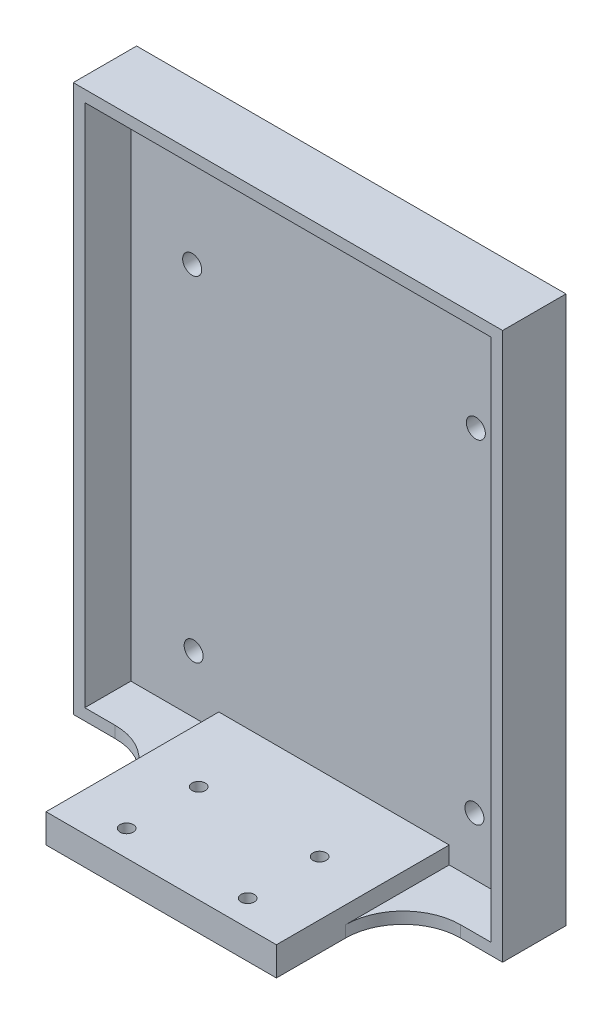
ISO-10303-21;
HEADER;
FILE_DESCRIPTION(('STEP AP214'),'2;1');
FILE_NAME('part.step','',(''),(''),'','','');
FILE_SCHEMA(('AUTOMOTIVE_DESIGN { 1 0 10303 214 1 1 1 1 }'));
ENDSEC;
DATA;
#1=APPLICATION_CONTEXT('core data for automotive mechanical design processes');
#2=APPLICATION_PROTOCOL_DEFINITION('international standard','automotive_design',2000,#1);
#3=PRODUCT_CONTEXT('',#1,'mechanical');
#4=PRODUCT('Part','Part','',(#3));
#5=PRODUCT_RELATED_PRODUCT_CATEGORY('part','',(#4));
#6=PRODUCT_DEFINITION_FORMATION('','',#4);
#7=PRODUCT_DEFINITION_CONTEXT('part definition',#1,'design');
#8=PRODUCT_DEFINITION('design','',#6,#7);
#9=PRODUCT_DEFINITION_SHAPE('','',#8);
#10=(LENGTH_UNIT() NAMED_UNIT(*) SI_UNIT(.MILLI.,.METRE.));
#11=(NAMED_UNIT(*) PLANE_ANGLE_UNIT() SI_UNIT($,.RADIAN.));
#12=(NAMED_UNIT(*) SI_UNIT($,.STERADIAN.) SOLID_ANGLE_UNIT());
#13=UNCERTAINTY_MEASURE_WITH_UNIT(LENGTH_MEASURE(1.E-05),#10,'distance_accuracy_value','');
#14=(GEOMETRIC_REPRESENTATION_CONTEXT(3) GLOBAL_UNCERTAINTY_ASSIGNED_CONTEXT((#13)) GLOBAL_UNIT_ASSIGNED_CONTEXT((#10,
#11,#12)) REPRESENTATION_CONTEXT('',''));
#15=CARTESIAN_POINT('',(0.,0.,0.));
#16=DIRECTION('',(0.,0.,1.));
#17=DIRECTION('',(1.,0.,0.));
#18=AXIS2_PLACEMENT_3D('',#15,#16,#17);
#19=CARTESIAN_POINT('',(-40.75,30.0000000005055,15.));
#20=DIRECTION('',(0.,0.,-1.));
#21=DIRECTION('',(-1.,0.,0.));
#22=AXIS2_PLACEMENT_3D('',#19,#20,#21);
#23=PLANE('',#22);
#24=CARTESIAN_POINT('',(-24.3737315862268,-132.994352953967,15.));
#25=DIRECTION('',(0.,0.,-1.));
#26=DIRECTION('',(-1.,0.,0.));
#27=AXIS2_PLACEMENT_3D('',#24,#25,#26);
#28=CIRCLE('',#27,1.65000000000001);
#29=CARTESIAN_POINT('',(-26.0237315862268,-132.994352953967,15.));
#30=VERTEX_POINT('',#29);
#31=EDGE_CURVE('E270',#30,#30,#28,.T.);
#32=ORIENTED_EDGE('',*,*,#31,.T.);
#33=EDGE_LOOP('',(#32));
#34=FACE_BOUND('',#33,.T.);
#35=CARTESIAN_POINT('',(24.6262684137732,-74.9943529539672,15.));
#36=DIRECTION('',(0.,0.,-1.));
#37=DIRECTION('',(-1.,0.,0.));
#38=AXIS2_PLACEMENT_3D('',#35,#36,#37);
#39=CIRCLE('',#38,1.65);
#40=CARTESIAN_POINT('',(22.9762684137732,-74.9943529539672,15.));
#41=VERTEX_POINT('',#40);
#42=EDGE_CURVE('E279',#41,#41,#39,.T.);
#43=ORIENTED_EDGE('',*,*,#42,.T.);
#44=EDGE_LOOP('',(#43));
#45=FACE_BOUND('',#44,.T.);
#46=CARTESIAN_POINT('',(-24.6262684137732,-74.9943529539672,15.));
#47=DIRECTION('',(0.,0.,-1.));
#48=DIRECTION('',(-1.,0.,0.));
#49=AXIS2_PLACEMENT_3D('',#46,#47,#48);
#50=CIRCLE('',#49,1.65);
#51=CARTESIAN_POINT('',(-26.2762684137732,-74.9943529539672,15.));
#52=VERTEX_POINT('',#51);
#53=EDGE_CURVE('E282',#52,#52,#50,.T.);
#54=ORIENTED_EDGE('',*,*,#53,.T.);
#55=EDGE_LOOP('',(#54));
#56=FACE_BOUND('',#55,.T.);
#57=CARTESIAN_POINT('',(24.3737315862268,-132.994352953967,15.));
#58=DIRECTION('',(0.,0.,-1.));
#59=DIRECTION('',(-1.,0.,0.));
#60=AXIS2_PLACEMENT_3D('',#57,#58,#59);
#61=CIRCLE('',#60,1.65000000000001);
#62=CARTESIAN_POINT('',(22.7237315862268,-132.994352953967,15.));
#63=VERTEX_POINT('',#62);
#64=EDGE_CURVE('E285',#63,#63,#61,.T.);
#65=ORIENTED_EDGE('',*,*,#64,.T.);
#66=EDGE_LOOP('',(#65));
#67=FACE_BOUND('',#66,.T.);
#68=DIRECTION('',(0.,-1.,0.));
#69=VECTOR('',#68,1.);
#70=CARTESIAN_POINT('',(-35.2737315862268,-51.9943529539672,15.));
#71=LINE('',#70,#69);
#72=CARTESIAN_POINT('',(-35.2737315862268,-51.9943529539672,15.));
#73=VERTEX_POINT('',#72);
#74=CARTESIAN_POINT('',(-35.2737315862268,-142.994352953967,15.));
#75=VERTEX_POINT('',#74);
#76=EDGE_CURVE('E193',#73,#75,#71,.T.);
#77=ORIENTED_EDGE('',*,*,#76,.T.);
#78=DIRECTION('',(1.,0.,0.));
#79=VECTOR('',#78,1.);
#80=CARTESIAN_POINT('',(-35.2737315862268,-142.994352953967,15.));
#81=LINE('',#80,#79);
#82=CARTESIAN_POINT('',(-20.,-142.994352953967,15.));
#83=VERTEX_POINT('',#82);
#84=EDGE_CURVE('E177',#75,#83,#81,.T.);
#85=ORIENTED_EDGE('',*,*,#84,.T.);
#86=DIRECTION('',(0.,-1.,0.));
#87=VECTOR('',#86,1.);
#88=CARTESIAN_POINT('',(-20.,-139.994352953967,15.));
#89=LINE('',#88,#87);
#90=CARTESIAN_POINT('',(-20.,-139.994352953967,15.));
#91=VERTEX_POINT('',#90);
#92=EDGE_CURVE('E219',#91,#83,#89,.T.);
#93=ORIENTED_EDGE('',*,*,#92,.F.);
#94=DIRECTION('',(-1.,0.,0.));
#95=VECTOR('',#94,1.);
#96=CARTESIAN_POINT('',(-20.,-139.994352953967,15.));
#97=LINE('',#96,#95);
#98=CARTESIAN_POINT('',(20.,-139.994352953967,15.));
#99=VERTEX_POINT('',#98);
#100=EDGE_CURVE('E224',#99,#91,#97,.T.);
#101=ORIENTED_EDGE('',*,*,#100,.F.);
#102=DIRECTION('',(0.,1.,0.));
#103=VECTOR('',#102,1.);
#104=CARTESIAN_POINT('',(20.,-139.994352953967,15.));
#105=LINE('',#104,#103);
#106=CARTESIAN_POINT('',(20.,-142.994352953967,15.));
#107=VERTEX_POINT('',#106);
#108=EDGE_CURVE('E233',#107,#99,#105,.T.);
#109=ORIENTED_EDGE('',*,*,#108,.F.);
#110=CARTESIAN_POINT('',(35.2737315862269,-142.994352953967,15.));
#111=VERTEX_POINT('',#110);
#112=EDGE_CURVE('E195',#107,#111,#81,.T.);
#113=ORIENTED_EDGE('',*,*,#112,.T.);
#114=DIRECTION('',(0.,1.,0.));
#115=VECTOR('',#114,1.);
#116=CARTESIAN_POINT('',(35.2737315862269,-51.9943529539672,15.));
#117=LINE('',#116,#115);
#118=CARTESIAN_POINT('',(35.2737315862269,-51.9943529539672,15.));
#119=VERTEX_POINT('',#118);
#120=EDGE_CURVE('E197',#111,#119,#117,.T.);
#121=ORIENTED_EDGE('',*,*,#120,.T.);
#122=DIRECTION('',(-1.,0.,0.));
#123=VECTOR('',#122,1.);
#124=CARTESIAN_POINT('',(-35.2737315862268,-51.9943529539672,15.));
#125=LINE('',#124,#123);
#126=EDGE_CURVE('E168',#119,#73,#125,.T.);
#127=ORIENTED_EDGE('',*,*,#126,.T.);
#128=EDGE_LOOP('',(#77,#85,#93,#101,#109,#113,#121,#127));
#129=FACE_BOUND('',#128,.T.);
#130=ADVANCED_FACE('F41',(#34,#45,#56,#67,#129),#23,.F.);
#131=CARTESIAN_POINT('',(-37.2737315862268,-189.940495331641,15.));
#132=DIRECTION('',(1.,0.,0.));
#133=DIRECTION('',(0.,1.,0.));
#134=AXIS2_PLACEMENT_3D('',#131,#132,#133);
#135=PLANE('',#134);
#136=DIRECTION('',(0.,1.,0.));
#137=VECTOR('',#136,1.);
#138=CARTESIAN_POINT('',(-37.2737315862268,-49.9943529539672,12.));
#139=LINE('',#138,#137);
#140=CARTESIAN_POINT('',(-37.2737315862268,-144.994352953967,12.));
#141=VERTEX_POINT('',#140);
#142=CARTESIAN_POINT('',(-37.2737315862268,-49.9943529539672,12.));
#143=VERTEX_POINT('',#142);
#144=EDGE_CURVE('E251',#141,#143,#139,.T.);
#145=ORIENTED_EDGE('',*,*,#144,.F.);
#146=DIRECTION('',(0.,0.,1.));
#147=VECTOR('',#146,1.);
#148=CARTESIAN_POINT('',(-37.2737315862268,-144.994352953967,-12.));
#149=LINE('',#148,#147);
#150=CARTESIAN_POINT('',(-37.2737315862268,-144.994352953967,23.));
#151=VERTEX_POINT('',#150);
#152=EDGE_CURVE('E267',#141,#151,#149,.T.);
#153=ORIENTED_EDGE('',*,*,#152,.T.);
#154=DIRECTION('',(0.,-1.,0.));
#155=VECTOR('',#154,1.);
#156=CARTESIAN_POINT('',(-37.2737315862268,-49.9943529539672,23.));
#157=LINE('',#156,#155);
#158=CARTESIAN_POINT('',(-37.2737315862268,-49.9943529539672,23.));
#159=VERTEX_POINT('',#158);
#160=EDGE_CURVE('E178',#159,#151,#157,.T.);
#161=ORIENTED_EDGE('',*,*,#160,.F.);
#162=DIRECTION('',(0.,0.,1.));
#163=VECTOR('',#162,1.);
#164=CARTESIAN_POINT('',(-37.2737315862268,-49.9943529539672,-12.));
#165=LINE('',#164,#163);
#166=EDGE_CURVE('E268',#143,#159,#165,.T.);
#167=ORIENTED_EDGE('',*,*,#166,.F.);
#168=EDGE_LOOP('',(#145,#153,#161,#167));
#169=FACE_BOUND('',#168,.T.);
#170=ADVANCED_FACE('F332',(#169),#135,.F.);
#171=CARTESIAN_POINT('',(37.2737315862269,-189.940495331641,15.));
#172=DIRECTION('',(-1.,0.,0.));
#173=DIRECTION('',(0.,0.,1.));
#174=AXIS2_PLACEMENT_3D('',#171,#172,#173);
#175=PLANE('',#174);
#176=DIRECTION('',(0.,-1.,0.));
#177=VECTOR('',#176,1.);
#178=CARTESIAN_POINT('',(37.2737315862269,-49.9943529539672,12.));
#179=LINE('',#178,#177);
#180=CARTESIAN_POINT('',(37.2737315862269,-49.9943529539672,12.));
#181=VERTEX_POINT('',#180);
#182=CARTESIAN_POINT('',(37.2737315862269,-144.994352953967,12.));
#183=VERTEX_POINT('',#182);
#184=EDGE_CURVE('E247',#181,#183,#179,.T.);
#185=ORIENTED_EDGE('',*,*,#184,.F.);
#186=DIRECTION('',(0.,0.,1.));
#187=VECTOR('',#186,1.);
#188=CARTESIAN_POINT('',(37.2737315862269,-49.9943529539672,-12.));
#189=LINE('',#188,#187);
#190=CARTESIAN_POINT('',(37.2737315862269,-49.9943529539672,23.));
#191=VERTEX_POINT('',#190);
#192=EDGE_CURVE('E271',#181,#191,#189,.T.);
#193=ORIENTED_EDGE('',*,*,#192,.T.);
#194=DIRECTION('',(0.,1.,0.));
#195=VECTOR('',#194,1.);
#196=CARTESIAN_POINT('',(37.2737315862269,-49.9943529539672,23.));
#197=LINE('',#196,#195);
#198=CARTESIAN_POINT('',(37.2737315862269,-144.994352953967,23.));
#199=VERTEX_POINT('',#198);
#200=EDGE_CURVE('E211',#199,#191,#197,.T.);
#201=ORIENTED_EDGE('',*,*,#200,.F.);
#202=DIRECTION('',(0.,0.,1.));
#203=VECTOR('',#202,1.);
#204=CARTESIAN_POINT('',(37.2737315862269,-144.994352953967,-12.));
#205=LINE('',#204,#203);
#206=EDGE_CURVE('E273',#183,#199,#205,.T.);
#207=ORIENTED_EDGE('',*,*,#206,.F.);
#208=EDGE_LOOP('',(#185,#193,#201,#207));
#209=FACE_BOUND('',#208,.T.);
#210=ADVANCED_FACE('F339',(#209),#175,.F.);
#211=CARTESIAN_POINT('',(24.6262684137732,-74.9943529539672,-12.));
#212=DIRECTION('',(0.,0.,1.));
#213=DIRECTION('',(1.,0.,0.));
#214=AXIS2_PLACEMENT_3D('',#211,#212,#213);
#215=CYLINDRICAL_SURFACE('',#214,1.65);
#216=ORIENTED_EDGE('',*,*,#42,.F.);
#217=EDGE_LOOP('',(#216));
#218=FACE_BOUND('',#217,.T.);
#219=CARTESIAN_POINT('',(24.6262684137732,-74.9943529539672,12.));
#220=DIRECTION('',(0.,0.,-1.));
#221=DIRECTION('',(-1.,0.,0.));
#222=AXIS2_PLACEMENT_3D('',#219,#220,#221);
#223=CIRCLE('',#222,1.65);
#224=CARTESIAN_POINT('',(22.9762684137732,-74.9943529539672,12.));
#225=VERTEX_POINT('',#224);
#226=EDGE_CURVE('E264',#225,#225,#223,.F.);
#227=ORIENTED_EDGE('',*,*,#226,.F.);
#228=EDGE_LOOP('',(#227));
#229=FACE_BOUND('',#228,.T.);
#230=ADVANCED_FACE('F348',(#218,#229),#215,.F.);
#231=CARTESIAN_POINT('',(24.3737315862268,-132.994352953967,-12.));
#232=DIRECTION('',(0.,0.,1.));
#233=DIRECTION('',(1.,0.,0.));
#234=AXIS2_PLACEMENT_3D('',#231,#232,#233);
#235=CYLINDRICAL_SURFACE('',#234,1.65000000000001);
#236=ORIENTED_EDGE('',*,*,#64,.F.);
#237=EDGE_LOOP('',(#236));
#238=FACE_BOUND('',#237,.T.);
#239=CARTESIAN_POINT('',(24.3737315862268,-132.994352953967,12.));
#240=DIRECTION('',(0.,0.,-1.));
#241=DIRECTION('',(-1.,0.,0.));
#242=AXIS2_PLACEMENT_3D('',#239,#240,#241);
#243=CIRCLE('',#242,1.65000000000001);
#244=CARTESIAN_POINT('',(22.7237315862268,-132.994352953967,12.));
#245=VERTEX_POINT('',#244);
#246=EDGE_CURVE('E261',#245,#245,#243,.F.);
#247=ORIENTED_EDGE('',*,*,#246,.F.);
#248=EDGE_LOOP('',(#247));
#249=FACE_BOUND('',#248,.T.);
#250=ADVANCED_FACE('F425',(#238,#249),#235,.F.);
#251=CARTESIAN_POINT('',(-24.3737315862268,-132.994352953967,-12.));
#252=DIRECTION('',(0.,0.,1.));
#253=DIRECTION('',(1.,0.,0.));
#254=AXIS2_PLACEMENT_3D('',#251,#252,#253);
#255=CYLINDRICAL_SURFACE('',#254,1.65000000000001);
#256=ORIENTED_EDGE('',*,*,#31,.F.);
#257=EDGE_LOOP('',(#256));
#258=FACE_BOUND('',#257,.T.);
#259=CARTESIAN_POINT('',(-24.3737315862268,-132.994352953967,12.));
#260=DIRECTION('',(0.,0.,-1.));
#261=DIRECTION('',(-1.,0.,0.));
#262=AXIS2_PLACEMENT_3D('',#259,#260,#261);
#263=CIRCLE('',#262,1.65000000000001);
#264=CARTESIAN_POINT('',(-26.0237315862268,-132.994352953967,12.));
#265=VERTEX_POINT('',#264);
#266=EDGE_CURVE('E258',#265,#265,#263,.F.);
#267=ORIENTED_EDGE('',*,*,#266,.F.);
#268=EDGE_LOOP('',(#267));
#269=FACE_BOUND('',#268,.T.);
#270=ADVANCED_FACE('F345',(#258,#269),#255,.F.);
#271=CARTESIAN_POINT('',(-24.6262684137732,-74.9943529539672,-12.));
#272=DIRECTION('',(0.,0.,1.));
#273=DIRECTION('',(1.,0.,0.));
#274=AXIS2_PLACEMENT_3D('',#271,#272,#273);
#275=CYLINDRICAL_SURFACE('',#274,1.65);
#276=ORIENTED_EDGE('',*,*,#53,.F.);
#277=EDGE_LOOP('',(#276));
#278=FACE_BOUND('',#277,.T.);
#279=CARTESIAN_POINT('',(-24.6262684137732,-74.9943529539672,12.));
#280=DIRECTION('',(0.,0.,-1.));
#281=DIRECTION('',(-1.,0.,0.));
#282=AXIS2_PLACEMENT_3D('',#279,#280,#281);
#283=CIRCLE('',#282,1.65);
#284=CARTESIAN_POINT('',(-26.2762684137732,-74.9943529539672,12.));
#285=VERTEX_POINT('',#284);
#286=EDGE_CURVE('E255',#285,#285,#283,.F.);
#287=ORIENTED_EDGE('',*,*,#286,.F.);
#288=EDGE_LOOP('',(#287));
#289=FACE_BOUND('',#288,.T.);
#290=ADVANCED_FACE('F421',(#278,#289),#275,.F.);
#291=CARTESIAN_POINT('',(-37.2737315862268,-144.994352953967,-12.));
#292=DIRECTION('',(0.,-1.,0.));
#293=DIRECTION('',(0.,0.,-1.));
#294=AXIS2_PLACEMENT_3D('',#291,#292,#293);
#295=PLANE('',#294);
#296=CARTESIAN_POINT('',(10.5,-144.994352953967,40.5));
#297=DIRECTION('',(0.,-1.,0.));
#298=DIRECTION('',(0.,0.,-1.));
#299=AXIS2_PLACEMENT_3D('',#296,#297,#298);
#300=CIRCLE('',#299,1.15);
#301=CARTESIAN_POINT('',(10.5,-144.994352953967,39.35));
#302=VERTEX_POINT('',#301);
#303=EDGE_CURVE('E587',#302,#302,#300,.T.);
#304=ORIENTED_EDGE('',*,*,#303,.F.);
#305=EDGE_LOOP('',(#304));
#306=FACE_BOUND('',#305,.T.);
#307=CARTESIAN_POINT('',(-10.5,-144.994352953967,28.));
#308=DIRECTION('',(0.,-1.,0.));
#309=DIRECTION('',(0.,0.,-1.));
#310=AXIS2_PLACEMENT_3D('',#307,#308,#309);
#311=CIRCLE('',#310,1.15);
#312=CARTESIAN_POINT('',(-10.5,-144.994352953967,26.85));
#313=VERTEX_POINT('',#312);
#314=EDGE_CURVE('E584',#313,#313,#311,.T.);
#315=ORIENTED_EDGE('',*,*,#314,.F.);
#316=EDGE_LOOP('',(#315));
#317=FACE_BOUND('',#316,.T.);
#318=CARTESIAN_POINT('',(10.5,-144.994352953967,28.));
#319=DIRECTION('',(0.,-1.,0.));
#320=DIRECTION('',(0.,0.,-1.));
#321=AXIS2_PLACEMENT_3D('',#318,#319,#320);
#322=CIRCLE('',#321,1.15);
#323=CARTESIAN_POINT('',(10.5,-144.994352953967,26.85));
#324=VERTEX_POINT('',#323);
#325=EDGE_CURVE('E577',#324,#324,#322,.T.);
#326=ORIENTED_EDGE('',*,*,#325,.F.);
#327=EDGE_LOOP('',(#326));
#328=FACE_BOUND('',#327,.T.);
#329=CARTESIAN_POINT('',(-10.5,-144.994352953967,40.5));
#330=DIRECTION('',(0.,-1.,0.));
#331=DIRECTION('',(0.,0.,-1.));
#332=AXIS2_PLACEMENT_3D('',#329,#330,#331);
#333=CIRCLE('',#332,1.15);
#334=CARTESIAN_POINT('',(-10.5,-144.994352953967,39.35));
#335=VERTEX_POINT('',#334);
#336=EDGE_CURVE('E307',#335,#335,#333,.T.);
#337=ORIENTED_EDGE('',*,*,#336,.F.);
#338=EDGE_LOOP('',(#337));
#339=FACE_BOUND('',#338,.T.);
#340=DIRECTION('',(0.,0.,-1.));
#341=VECTOR('',#340,1.);
#342=CARTESIAN_POINT('',(-20.,-144.994352953967,45.));
#343=LINE('',#342,#341);
#344=CARTESIAN_POINT('',(-20.,-144.994352953967,45.));
#345=VERTEX_POINT('',#344);
#346=CARTESIAN_POINT('',(-20.,-144.994352953967,33.));
#347=VERTEX_POINT('',#346);
#348=EDGE_CURVE('E244',#345,#347,#343,.T.);
#349=ORIENTED_EDGE('',*,*,#348,.T.);
#350=CARTESIAN_POINT('',(-30.,-144.994352953967,33.));
#351=DIRECTION('',(0.,-1.,0.));
#352=DIRECTION('',(0.,0.,-1.));
#353=AXIS2_PLACEMENT_3D('',#350,#351,#352);
#354=CIRCLE('',#353,10.);
#355=CARTESIAN_POINT('',(-30.,-144.994352953967,23.));
#356=VERTEX_POINT('',#355);
#357=EDGE_CURVE('E298',#347,#356,#354,.F.);
#358=ORIENTED_EDGE('',*,*,#357,.T.);
#359=DIRECTION('',(1.,0.,0.));
#360=VECTOR('',#359,1.);
#361=CARTESIAN_POINT('',(-37.2737315862268,-144.994352953967,23.));
#362=LINE('',#361,#360);
#363=EDGE_CURVE('E209',#151,#356,#362,.T.);
#364=ORIENTED_EDGE('',*,*,#363,.F.);
#365=ORIENTED_EDGE('',*,*,#152,.F.);
#366=DIRECTION('',(-1.,0.,0.));
#367=VECTOR('',#366,1.);
#368=CARTESIAN_POINT('',(37.2737315862269,-144.994352953967,12.));
#369=LINE('',#368,#367);
#370=EDGE_CURVE('E249',#183,#141,#369,.T.);
#371=ORIENTED_EDGE('',*,*,#370,.F.);
#372=ORIENTED_EDGE('',*,*,#206,.T.);
#373=CARTESIAN_POINT('',(30.,-144.994352953967,23.));
#374=VERTEX_POINT('',#373);
#375=EDGE_CURVE('E208',#374,#199,#362,.T.);
#376=ORIENTED_EDGE('',*,*,#375,.F.);
#377=CARTESIAN_POINT('',(30.,-144.994352953967,33.));
#378=DIRECTION('',(0.,-1.,0.));
#379=DIRECTION('',(0.,0.,-1.));
#380=AXIS2_PLACEMENT_3D('',#377,#378,#379);
#381=CIRCLE('',#380,10.);
#382=CARTESIAN_POINT('',(20.,-144.994352953967,33.));
#383=VERTEX_POINT('',#382);
#384=EDGE_CURVE('E12',#374,#383,#381,.F.);
#385=ORIENTED_EDGE('',*,*,#384,.T.);
#386=DIRECTION('',(0.,0.,-1.));
#387=VECTOR('',#386,1.);
#388=CARTESIAN_POINT('',(20.,-144.994352953967,45.));
#389=LINE('',#388,#387);
#390=CARTESIAN_POINT('',(20.,-144.994352953967,45.));
#391=VERTEX_POINT('',#390);
#392=EDGE_CURVE('E242',#391,#383,#389,.T.);
#393=ORIENTED_EDGE('',*,*,#392,.F.);
#394=DIRECTION('',(1.,0.,0.));
#395=VECTOR('',#394,1.);
#396=CARTESIAN_POINT('',(-20.,-144.994352953967,45.));
#397=LINE('',#396,#395);
#398=EDGE_CURVE('E223',#345,#391,#397,.T.);
#399=ORIENTED_EDGE('',*,*,#398,.F.);
#400=EDGE_LOOP('',(#349,#358,#364,#365,#371,#372,#376,#385,#393,#399));
#401=FACE_BOUND('',#400,.T.);
#402=ADVANCED_FACE('F417',(#306,#317,#328,#339,#401),#295,.T.);
#403=CARTESIAN_POINT('',(-37.2737315862268,-49.9943529539672,-12.));
#404=DIRECTION('',(0.,1.,0.));
#405=DIRECTION('',(0.,0.,1.));
#406=AXIS2_PLACEMENT_3D('',#403,#404,#405);
#407=PLANE('',#406);
#408=ORIENTED_EDGE('',*,*,#192,.F.);
#409=DIRECTION('',(1.,0.,0.));
#410=VECTOR('',#409,1.);
#411=CARTESIAN_POINT('',(37.2737315862269,-49.9943529539672,12.));
#412=LINE('',#411,#410);
#413=EDGE_CURVE('E253',#143,#181,#412,.T.);
#414=ORIENTED_EDGE('',*,*,#413,.F.);
#415=ORIENTED_EDGE('',*,*,#166,.T.);
#416=DIRECTION('',(-1.,0.,0.));
#417=VECTOR('',#416,1.);
#418=CARTESIAN_POINT('',(-37.2737315862268,-49.9943529539672,23.));
#419=LINE('',#418,#417);
#420=EDGE_CURVE('E214',#191,#159,#419,.T.);
#421=ORIENTED_EDGE('',*,*,#420,.F.);
#422=EDGE_LOOP('',(#408,#414,#415,#421));
#423=FACE_BOUND('',#422,.T.);
#424=ADVANCED_FACE('F413',(#423),#407,.T.);
#425=CARTESIAN_POINT('',(0.,0.,12.));
#426=DIRECTION('',(0.,0.,-1.));
#427=DIRECTION('',(-1.,0.,0.));
#428=AXIS2_PLACEMENT_3D('',#425,#426,#427);
#429=PLANE('',#428);
#430=ORIENTED_EDGE('',*,*,#184,.T.);
#431=ORIENTED_EDGE('',*,*,#370,.T.);
#432=ORIENTED_EDGE('',*,*,#144,.T.);
#433=ORIENTED_EDGE('',*,*,#413,.T.);
#434=EDGE_LOOP('',(#430,#431,#432,#433));
#435=FACE_BOUND('',#434,.T.);
#436=ORIENTED_EDGE('',*,*,#286,.T.);
#437=EDGE_LOOP('',(#436));
#438=FACE_BOUND('',#437,.T.);
#439=ORIENTED_EDGE('',*,*,#266,.T.);
#440=EDGE_LOOP('',(#439));
#441=FACE_BOUND('',#440,.T.);
#442=ORIENTED_EDGE('',*,*,#246,.T.);
#443=EDGE_LOOP('',(#442));
#444=FACE_BOUND('',#443,.T.);
#445=ORIENTED_EDGE('',*,*,#226,.T.);
#446=EDGE_LOOP('',(#445));
#447=FACE_BOUND('',#446,.T.);
#448=ADVANCED_FACE('F410',(#435,#438,#441,#444,#447),#429,.T.);
#449=CARTESIAN_POINT('',(-20.,-139.994352953967,45.));
#450=DIRECTION('',(1.,0.,0.));
#451=DIRECTION('',(0.,1.,0.));
#452=AXIS2_PLACEMENT_3D('',#449,#450,#451);
#453=PLANE('',#452);
#454=DIRECTION('',(0.,0.,1.));
#455=VECTOR('',#454,1.);
#456=CARTESIAN_POINT('',(-20.,-142.994352953967,45.));
#457=LINE('',#456,#455);
#458=CARTESIAN_POINT('',(-20.,-142.994352953967,33.));
#459=VERTEX_POINT('',#458);
#460=EDGE_CURVE('E217',#83,#459,#457,.T.);
#461=ORIENTED_EDGE('',*,*,#460,.T.);
#462=DIRECTION('',(0.,-1.,0.));
#463=VECTOR('',#462,1.);
#464=CARTESIAN_POINT('',(-20.,-139.994352953967,33.));
#465=LINE('',#464,#463);
#466=EDGE_CURVE('E289',#459,#347,#465,.T.);
#467=ORIENTED_EDGE('',*,*,#466,.T.);
#468=ORIENTED_EDGE('',*,*,#348,.F.);
#469=DIRECTION('',(0.,-1.,0.));
#470=VECTOR('',#469,1.);
#471=CARTESIAN_POINT('',(-20.,-139.994352953967,45.));
#472=LINE('',#471,#470);
#473=CARTESIAN_POINT('',(-20.,-139.994352953967,45.));
#474=VERTEX_POINT('',#473);
#475=EDGE_CURVE('E220',#474,#345,#472,.T.);
#476=ORIENTED_EDGE('',*,*,#475,.F.);
#477=DIRECTION('',(0.,0.,-1.));
#478=VECTOR('',#477,1.);
#479=CARTESIAN_POINT('',(-20.,-139.994352953967,45.));
#480=LINE('',#479,#478);
#481=EDGE_CURVE('E230',#474,#91,#480,.T.);
#482=ORIENTED_EDGE('',*,*,#481,.T.);
#483=ORIENTED_EDGE('',*,*,#92,.T.);
#484=EDGE_LOOP('',(#461,#467,#468,#476,#482,#483));
#485=FACE_BOUND('',#484,.T.);
#486=ADVANCED_FACE('F368',(#485),#453,.F.);
#487=CARTESIAN_POINT('',(20.,-139.994352953967,45.));
#488=DIRECTION('',(-1.,0.,0.));
#489=DIRECTION('',(0.,-1.,0.));
#490=AXIS2_PLACEMENT_3D('',#487,#488,#489);
#491=PLANE('',#490);
#492=ORIENTED_EDGE('',*,*,#392,.T.);
#493=DIRECTION('',(0.,1.,0.));
#494=VECTOR('',#493,1.);
#495=CARTESIAN_POINT('',(20.,-139.994352953967,33.));
#496=LINE('',#495,#494);
#497=CARTESIAN_POINT('',(20.,-142.994352953967,33.));
#498=VERTEX_POINT('',#497);
#499=EDGE_CURVE('E295',#383,#498,#496,.T.);
#500=ORIENTED_EDGE('',*,*,#499,.T.);
#501=DIRECTION('',(0.,0.,-1.));
#502=VECTOR('',#501,1.);
#503=CARTESIAN_POINT('',(20.,-142.994352953967,45.));
#504=LINE('',#503,#502);
#505=EDGE_CURVE('E58',#498,#107,#504,.T.);
#506=ORIENTED_EDGE('',*,*,#505,.T.);
#507=ORIENTED_EDGE('',*,*,#108,.T.);
#508=DIRECTION('',(0.,0.,-1.));
#509=VECTOR('',#508,1.);
#510=CARTESIAN_POINT('',(20.,-139.994352953967,45.));
#511=LINE('',#510,#509);
#512=CARTESIAN_POINT('',(20.,-139.994352953967,45.));
#513=VERTEX_POINT('',#512);
#514=EDGE_CURVE('E239',#513,#99,#511,.T.);
#515=ORIENTED_EDGE('',*,*,#514,.F.);
#516=DIRECTION('',(0.,1.,0.));
#517=VECTOR('',#516,1.);
#518=CARTESIAN_POINT('',(20.,-139.994352953967,45.));
#519=LINE('',#518,#517);
#520=EDGE_CURVE('E226',#391,#513,#519,.T.);
#521=ORIENTED_EDGE('',*,*,#520,.F.);
#522=EDGE_LOOP('',(#492,#500,#506,#507,#515,#521));
#523=FACE_BOUND('',#522,.T.);
#524=ADVANCED_FACE('F378',(#523),#491,.F.);
#525=CARTESIAN_POINT('',(-20.,-139.994352953967,45.));
#526=DIRECTION('',(0.,-1.,0.));
#527=DIRECTION('',(0.,0.,-1.));
#528=AXIS2_PLACEMENT_3D('',#525,#526,#527);
#529=PLANE('',#528);
#530=CARTESIAN_POINT('',(10.5,-139.994352953967,40.5));
#531=DIRECTION('',(0.,-1.,0.));
#532=DIRECTION('',(0.,0.,-1.));
#533=AXIS2_PLACEMENT_3D('',#530,#531,#532);
#534=CIRCLE('',#533,1.15);
#535=CARTESIAN_POINT('',(10.5,-139.994352953967,39.35));
#536=VERTEX_POINT('',#535);
#537=EDGE_CURVE('E45',#536,#536,#534,.T.);
#538=ORIENTED_EDGE('',*,*,#537,.T.);
#539=EDGE_LOOP('',(#538));
#540=FACE_BOUND('',#539,.T.);
#541=CARTESIAN_POINT('',(-10.5,-139.994352953967,28.));
#542=DIRECTION('',(0.,-1.,0.));
#543=DIRECTION('',(0.,0.,-1.));
#544=AXIS2_PLACEMENT_3D('',#541,#542,#543);
#545=CIRCLE('',#544,1.15);
#546=CARTESIAN_POINT('',(-10.5,-139.994352953967,26.85));
#547=VERTEX_POINT('',#546);
#548=EDGE_CURVE('E309',#547,#547,#545,.T.);
#549=ORIENTED_EDGE('',*,*,#548,.T.);
#550=EDGE_LOOP('',(#549));
#551=FACE_BOUND('',#550,.T.);
#552=CARTESIAN_POINT('',(10.5,-139.994352953967,28.));
#553=DIRECTION('',(0.,-1.,0.));
#554=DIRECTION('',(0.,0.,-1.));
#555=AXIS2_PLACEMENT_3D('',#552,#553,#554);
#556=CIRCLE('',#555,1.15);
#557=CARTESIAN_POINT('',(10.5,-139.994352953967,26.85));
#558=VERTEX_POINT('',#557);
#559=EDGE_CURVE('E306',#558,#558,#556,.T.);
#560=ORIENTED_EDGE('',*,*,#559,.T.);
#561=EDGE_LOOP('',(#560));
#562=FACE_BOUND('',#561,.T.);
#563=CARTESIAN_POINT('',(-10.5,-139.994352953967,40.5));
#564=DIRECTION('',(0.,-1.,0.));
#565=DIRECTION('',(0.,0.,-1.));
#566=AXIS2_PLACEMENT_3D('',#563,#564,#565);
#567=CIRCLE('',#566,1.15);
#568=CARTESIAN_POINT('',(-10.5,-139.994352953967,39.35));
#569=VERTEX_POINT('',#568);
#570=EDGE_CURVE('E303',#569,#569,#567,.T.);
#571=ORIENTED_EDGE('',*,*,#570,.T.);
#572=EDGE_LOOP('',(#571));
#573=FACE_BOUND('',#572,.T.);
#574=ORIENTED_EDGE('',*,*,#100,.T.);
#575=ORIENTED_EDGE('',*,*,#481,.F.);
#576=DIRECTION('',(-1.,0.,0.));
#577=VECTOR('',#576,1.);
#578=CARTESIAN_POINT('',(-20.,-139.994352953967,45.));
#579=LINE('',#578,#577);
#580=EDGE_CURVE('E228',#513,#474,#579,.T.);
#581=ORIENTED_EDGE('',*,*,#580,.F.);
#582=ORIENTED_EDGE('',*,*,#514,.T.);
#583=EDGE_LOOP('',(#574,#575,#581,#582));
#584=FACE_BOUND('',#583,.T.);
#585=ADVANCED_FACE('F316',(#540,#551,#562,#573,#584),#529,.F.);
#586=CARTESIAN_POINT('',(0.,0.,45.));
#587=DIRECTION('',(0.,0.,1.));
#588=DIRECTION('',(1.,0.,0.));
#589=AXIS2_PLACEMENT_3D('',#586,#587,#588);
#590=PLANE('',#589);
#591=ORIENTED_EDGE('',*,*,#475,.T.);
#592=ORIENTED_EDGE('',*,*,#398,.T.);
#593=ORIENTED_EDGE('',*,*,#520,.T.);
#594=ORIENTED_EDGE('',*,*,#580,.T.);
#595=EDGE_LOOP('',(#591,#592,#593,#594));
#596=FACE_BOUND('',#595,.T.);
#597=ADVANCED_FACE('F401',(#596),#590,.T.);
#598=CARTESIAN_POINT('',(0.,0.,23.));
#599=DIRECTION('',(0.,0.,1.));
#600=DIRECTION('',(1.,0.,0.));
#601=AXIS2_PLACEMENT_3D('',#598,#599,#600);
#602=PLANE('',#601);
#603=ORIENTED_EDGE('',*,*,#363,.T.);
#604=DIRECTION('',(0.,-1.,0.));
#605=VECTOR('',#604,1.);
#606=CARTESIAN_POINT('',(-30.0000000000002,0.,23.));
#607=LINE('',#606,#605);
#608=CARTESIAN_POINT('',(-30.,-142.994352953967,23.));
#609=VERTEX_POINT('',#608);
#610=EDGE_CURVE('E184',#356,#609,#607,.F.);
#611=ORIENTED_EDGE('',*,*,#610,.T.);
#612=DIRECTION('',(1.,0.,0.));
#613=VECTOR('',#612,1.);
#614=CARTESIAN_POINT('',(-35.2737315862268,-142.994352953967,23.));
#615=LINE('',#614,#613);
#616=CARTESIAN_POINT('',(-35.2737315862268,-142.994352953967,23.));
#617=VERTEX_POINT('',#616);
#618=EDGE_CURVE('E174',#617,#609,#615,.T.);
#619=ORIENTED_EDGE('',*,*,#618,.F.);
#620=DIRECTION('',(0.,-1.,0.));
#621=VECTOR('',#620,1.);
#622=CARTESIAN_POINT('',(-35.2737315862268,-51.9943529539672,23.));
#623=LINE('',#622,#621);
#624=CARTESIAN_POINT('',(-35.2737315862268,-51.9943529539672,23.));
#625=VERTEX_POINT('',#624);
#626=EDGE_CURVE('E157',#625,#617,#623,.T.);
#627=ORIENTED_EDGE('',*,*,#626,.F.);
#628=DIRECTION('',(-1.,0.,0.));
#629=VECTOR('',#628,1.);
#630=CARTESIAN_POINT('',(-35.2737315862268,-51.9943529539672,23.));
#631=LINE('',#630,#629);
#632=CARTESIAN_POINT('',(35.2737315862269,-51.9943529539672,23.));
#633=VERTEX_POINT('',#632);
#634=EDGE_CURVE('E188',#633,#625,#631,.T.);
#635=ORIENTED_EDGE('',*,*,#634,.F.);
#636=DIRECTION('',(0.,1.,0.));
#637=VECTOR('',#636,1.);
#638=CARTESIAN_POINT('',(35.2737315862269,-51.9943529539672,23.));
#639=LINE('',#638,#637);
#640=CARTESIAN_POINT('',(35.2737315862269,-142.994352953967,23.));
#641=VERTEX_POINT('',#640);
#642=EDGE_CURVE('E185',#641,#633,#639,.T.);
#643=ORIENTED_EDGE('',*,*,#642,.F.);
#644=CARTESIAN_POINT('',(30.,-142.994352953967,23.));
#645=VERTEX_POINT('',#644);
#646=EDGE_CURVE('E167',#645,#641,#615,.T.);
#647=ORIENTED_EDGE('',*,*,#646,.F.);
#648=DIRECTION('',(0.,1.,0.));
#649=VECTOR('',#648,1.);
#650=CARTESIAN_POINT('',(30.0000000000002,0.,23.));
#651=LINE('',#650,#649);
#652=EDGE_CURVE('E292',#645,#374,#651,.F.);
#653=ORIENTED_EDGE('',*,*,#652,.T.);
#654=ORIENTED_EDGE('',*,*,#375,.T.);
#655=ORIENTED_EDGE('',*,*,#200,.T.);
#656=ORIENTED_EDGE('',*,*,#420,.T.);
#657=ORIENTED_EDGE('',*,*,#160,.T.);
#658=EDGE_LOOP('',(#603,#611,#619,#627,#635,#643,#647,#653,#654,#655,#656,#657));
#659=FACE_BOUND('',#658,.T.);
#660=ADVANCED_FACE('F182',(#659),#602,.T.);
#661=CARTESIAN_POINT('',(-35.2737315862268,-142.994352953967,23.));
#662=DIRECTION('',(0.,1.,0.));
#663=DIRECTION('',(0.,0.,1.));
#664=AXIS2_PLACEMENT_3D('',#661,#662,#663);
#665=PLANE('',#664);
#666=ORIENTED_EDGE('',*,*,#460,.F.);
#667=ORIENTED_EDGE('',*,*,#84,.F.);
#668=DIRECTION('',(0.,0.,-1.));
#669=VECTOR('',#668,1.);
#670=CARTESIAN_POINT('',(-35.2737315862268,-142.994352953967,23.));
#671=LINE('',#670,#669);
#672=EDGE_CURVE('E160',#617,#75,#671,.T.);
#673=ORIENTED_EDGE('',*,*,#672,.F.);
#674=ORIENTED_EDGE('',*,*,#618,.T.);
#675=CARTESIAN_POINT('',(-30.,-142.994352953967,33.));
#676=DIRECTION('',(0.,1.,0.));
#677=DIRECTION('',(0.,0.,1.));
#678=AXIS2_PLACEMENT_3D('',#675,#676,#677);
#679=CIRCLE('',#678,10.);
#680=EDGE_CURVE('E300',#609,#459,#679,.F.);
#681=ORIENTED_EDGE('',*,*,#680,.T.);
#682=EDGE_LOOP('',(#666,#667,#673,#674,#681));
#683=FACE_BOUND('',#682,.T.);
#684=ADVANCED_FACE('F172',(#683),#665,.T.);
#685=ORIENTED_EDGE('',*,*,#505,.F.);
#686=CARTESIAN_POINT('',(30.,-142.994352953967,33.));
#687=DIRECTION('',(0.,1.,0.));
#688=DIRECTION('',(0.,0.,1.));
#689=AXIS2_PLACEMENT_3D('',#686,#687,#688);
#690=CIRCLE('',#689,10.);
#691=EDGE_CURVE('E50',#498,#645,#690,.F.);
#692=ORIENTED_EDGE('',*,*,#691,.T.);
#693=ORIENTED_EDGE('',*,*,#646,.T.);
#694=DIRECTION('',(0.,0.,-1.));
#695=VECTOR('',#694,1.);
#696=CARTESIAN_POINT('',(35.2737315862269,-142.994352953967,23.));
#697=LINE('',#696,#695);
#698=EDGE_CURVE('E179',#641,#111,#697,.T.);
#699=ORIENTED_EDGE('',*,*,#698,.T.);
#700=ORIENTED_EDGE('',*,*,#112,.F.);
#701=EDGE_LOOP('',(#685,#692,#693,#699,#700));
#702=FACE_BOUND('',#701,.T.);
#703=ADVANCED_FACE('F383',(#702),#665,.T.);
#704=CARTESIAN_POINT('',(-35.2737315862268,-51.9943529539672,23.));
#705=DIRECTION('',(1.,0.,0.));
#706=DIRECTION('',(0.,0.,-1.));
#707=AXIS2_PLACEMENT_3D('',#704,#705,#706);
#708=PLANE('',#707);
#709=ORIENTED_EDGE('',*,*,#76,.F.);
#710=DIRECTION('',(0.,0.,-1.));
#711=VECTOR('',#710,1.);
#712=CARTESIAN_POINT('',(-35.2737315862268,-51.9943529539672,23.));
#713=LINE('',#712,#711);
#714=EDGE_CURVE('E163',#625,#73,#713,.T.);
#715=ORIENTED_EDGE('',*,*,#714,.F.);
#716=ORIENTED_EDGE('',*,*,#626,.T.);
#717=ORIENTED_EDGE('',*,*,#672,.T.);
#718=EDGE_LOOP('',(#709,#715,#716,#717));
#719=FACE_BOUND('',#718,.T.);
#720=ADVANCED_FACE('F159',(#719),#708,.T.);
#721=CARTESIAN_POINT('',(35.2737315862269,-51.9943529539672,23.));
#722=DIRECTION('',(-1.,0.,0.));
#723=DIRECTION('',(0.,0.,1.));
#724=AXIS2_PLACEMENT_3D('',#721,#722,#723);
#725=PLANE('',#724);
#726=ORIENTED_EDGE('',*,*,#120,.F.);
#727=ORIENTED_EDGE('',*,*,#698,.F.);
#728=ORIENTED_EDGE('',*,*,#642,.T.);
#729=DIRECTION('',(0.,0.,-1.));
#730=VECTOR('',#729,1.);
#731=CARTESIAN_POINT('',(35.2737315862269,-51.9943529539672,23.));
#732=LINE('',#731,#730);
#733=EDGE_CURVE('E203',#633,#119,#732,.T.);
#734=ORIENTED_EDGE('',*,*,#733,.T.);
#735=EDGE_LOOP('',(#726,#727,#728,#734));
#736=FACE_BOUND('',#735,.T.);
#737=ADVANCED_FACE('F361',(#736),#725,.T.);
#738=CARTESIAN_POINT('',(-35.2737315862268,-51.9943529539672,23.));
#739=DIRECTION('',(0.,-1.,0.));
#740=DIRECTION('',(0.,0.,-1.));
#741=AXIS2_PLACEMENT_3D('',#738,#739,#740);
#742=PLANE('',#741);
#743=ORIENTED_EDGE('',*,*,#126,.F.);
#744=ORIENTED_EDGE('',*,*,#733,.F.);
#745=ORIENTED_EDGE('',*,*,#634,.T.);
#746=ORIENTED_EDGE('',*,*,#714,.T.);
#747=EDGE_LOOP('',(#743,#744,#745,#746));
#748=FACE_BOUND('',#747,.T.);
#749=ADVANCED_FACE('F352',(#748),#742,.T.);
#750=CARTESIAN_POINT('',(-30.,-139.994352953967,33.));
#751=DIRECTION('',(0.,-1.,0.));
#752=DIRECTION('',(1.,0.,0.));
#753=AXIS2_PLACEMENT_3D('',#750,#751,#752);
#754=CYLINDRICAL_SURFACE('',#753,10.);
#755=ORIENTED_EDGE('',*,*,#680,.F.);
#756=ORIENTED_EDGE('',*,*,#610,.F.);
#757=ORIENTED_EDGE('',*,*,#357,.F.);
#758=ORIENTED_EDGE('',*,*,#466,.F.);
#759=EDGE_LOOP('',(#755,#756,#757,#758));
#760=FACE_BOUND('',#759,.T.);
#761=ADVANCED_FACE('F350',(#760),#754,.F.);
#762=CARTESIAN_POINT('',(30.,-139.994352953967,33.));
#763=DIRECTION('',(0.,1.,0.));
#764=DIRECTION('',(-1.,0.,0.));
#765=AXIS2_PLACEMENT_3D('',#762,#763,#764);
#766=CYLINDRICAL_SURFACE('',#765,10.);
#767=ORIENTED_EDGE('',*,*,#384,.F.);
#768=ORIENTED_EDGE('',*,*,#652,.F.);
#769=ORIENTED_EDGE('',*,*,#691,.F.);
#770=ORIENTED_EDGE('',*,*,#499,.F.);
#771=EDGE_LOOP('',(#767,#768,#769,#770));
#772=FACE_BOUND('',#771,.T.);
#773=ADVANCED_FACE('F43',(#772),#766,.F.);
#774=CARTESIAN_POINT('',(-10.5,-136.994352953967,40.5));
#775=DIRECTION('',(0.,-1.,0.));
#776=DIRECTION('',(0.,0.,-1.));
#777=AXIS2_PLACEMENT_3D('',#774,#775,#776);
#778=CYLINDRICAL_SURFACE('',#777,1.15);
#779=ORIENTED_EDGE('',*,*,#336,.T.);
#780=EDGE_LOOP('',(#779));
#781=FACE_BOUND('',#780,.T.);
#782=ORIENTED_EDGE('',*,*,#570,.F.);
#783=EDGE_LOOP('',(#782));
#784=FACE_BOUND('',#783,.T.);
#785=ADVANCED_FACE('F358',(#781,#784),#778,.F.);
#786=CARTESIAN_POINT('',(10.5,-136.994352953967,28.));
#787=DIRECTION('',(0.,-1.,0.));
#788=DIRECTION('',(0.,0.,-1.));
#789=AXIS2_PLACEMENT_3D('',#786,#787,#788);
#790=CYLINDRICAL_SURFACE('',#789,1.15);
#791=ORIENTED_EDGE('',*,*,#325,.T.);
#792=EDGE_LOOP('',(#791));
#793=FACE_BOUND('',#792,.T.);
#794=ORIENTED_EDGE('',*,*,#559,.F.);
#795=EDGE_LOOP('',(#794));
#796=FACE_BOUND('',#795,.T.);
#797=ADVANCED_FACE('F326',(#793,#796),#790,.F.);
#798=CARTESIAN_POINT('',(-10.5,-136.994352953967,28.));
#799=DIRECTION('',(0.,-1.,0.));
#800=DIRECTION('',(0.,0.,-1.));
#801=AXIS2_PLACEMENT_3D('',#798,#799,#800);
#802=CYLINDRICAL_SURFACE('',#801,1.15);
#803=ORIENTED_EDGE('',*,*,#314,.T.);
#804=EDGE_LOOP('',(#803));
#805=FACE_BOUND('',#804,.T.);
#806=ORIENTED_EDGE('',*,*,#548,.F.);
#807=EDGE_LOOP('',(#806));
#808=FACE_BOUND('',#807,.T.);
#809=ADVANCED_FACE('F320',(#805,#808),#802,.F.);
#810=CARTESIAN_POINT('',(10.5,-136.994352953967,40.5));
#811=DIRECTION('',(0.,-1.,0.));
#812=DIRECTION('',(0.,0.,-1.));
#813=AXIS2_PLACEMENT_3D('',#810,#811,#812);
#814=CYLINDRICAL_SURFACE('',#813,1.15);
#815=ORIENTED_EDGE('',*,*,#303,.T.);
#816=EDGE_LOOP('',(#815));
#817=FACE_BOUND('',#816,.T.);
#818=ORIENTED_EDGE('',*,*,#537,.F.);
#819=EDGE_LOOP('',(#818));
#820=FACE_BOUND('',#819,.T.);
#821=ADVANCED_FACE('F318',(#817,#820),#814,.F.);
#822=CLOSED_SHELL('',(#130,#170,#210,#230,#250,#270,#290,#402,#424,#448,#486,#524,#585,#597,
#660,#684,#703,#720,#737,#749,#761,#773,#785,#797,#809,#821));
#823=MANIFOLD_SOLID_BREP('B2',#822);
#824=ADVANCED_BREP_SHAPE_REPRESENTATION('',(#18,#823),#14);
#825=SHAPE_DEFINITION_REPRESENTATION(#9,#824);
ENDSEC;
END-ISO-10303-21;
